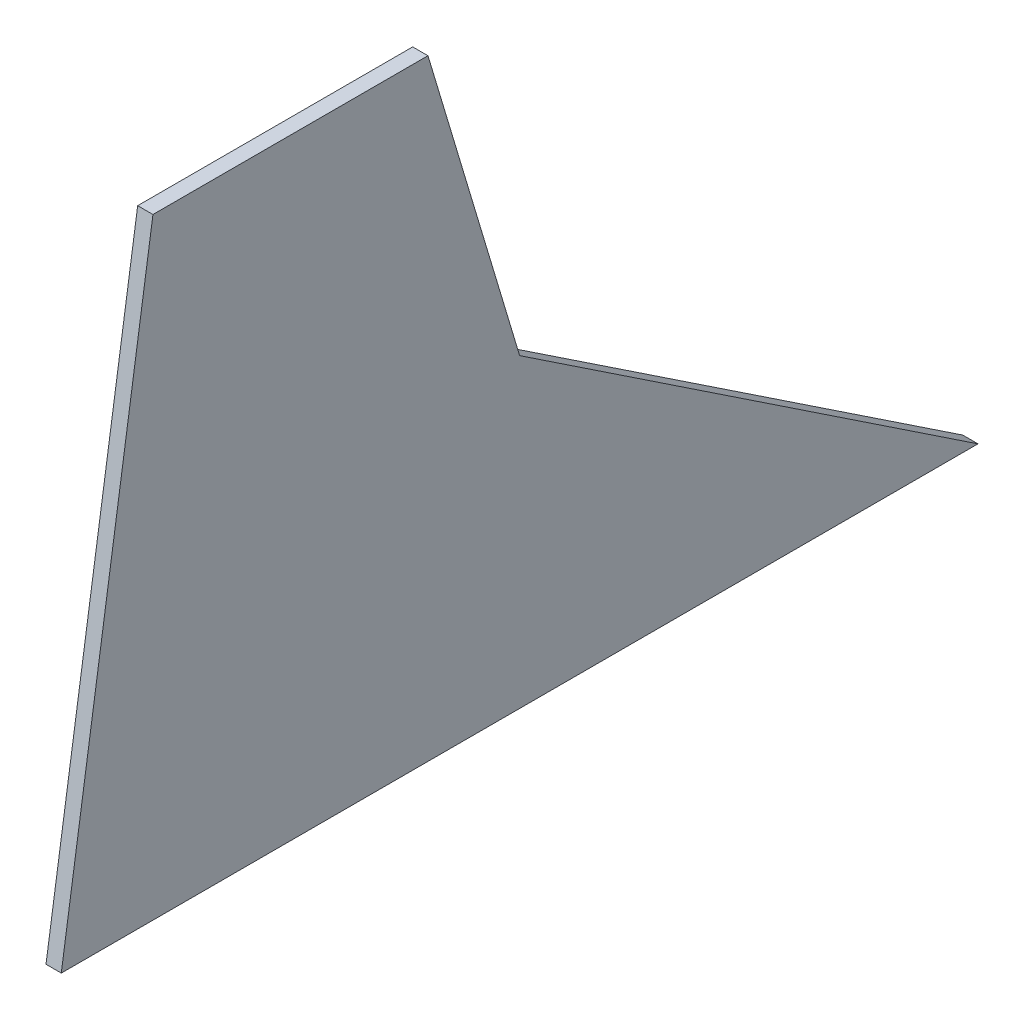
ISO-10303-21;
HEADER;
FILE_DESCRIPTION(('STEP AP214'),'2;1');
FILE_NAME('part.step','',(''),(''),'','','');
FILE_SCHEMA(('AUTOMOTIVE_DESIGN { 1 0 10303 214 1 1 1 1 }'));
ENDSEC;
DATA;
#1=APPLICATION_CONTEXT('core data for automotive mechanical design processes');
#2=APPLICATION_PROTOCOL_DEFINITION('international standard','automotive_design',2000,#1);
#3=PRODUCT_CONTEXT('',#1,'mechanical');
#4=PRODUCT('Part','Part','',(#3));
#5=PRODUCT_RELATED_PRODUCT_CATEGORY('part','',(#4));
#6=PRODUCT_DEFINITION_FORMATION('','',#4);
#7=PRODUCT_DEFINITION_CONTEXT('part definition',#1,'design');
#8=PRODUCT_DEFINITION('design','',#6,#7);
#9=PRODUCT_DEFINITION_SHAPE('','',#8);
#10=(LENGTH_UNIT() NAMED_UNIT(*) SI_UNIT(.MILLI.,.METRE.));
#11=(NAMED_UNIT(*) PLANE_ANGLE_UNIT() SI_UNIT($,.RADIAN.));
#12=(NAMED_UNIT(*) SI_UNIT($,.STERADIAN.) SOLID_ANGLE_UNIT());
#13=UNCERTAINTY_MEASURE_WITH_UNIT(LENGTH_MEASURE(1.E-05),#10,'distance_accuracy_value','');
#14=(GEOMETRIC_REPRESENTATION_CONTEXT(3) GLOBAL_UNCERTAINTY_ASSIGNED_CONTEXT((#13)) GLOBAL_UNIT_ASSIGNED_CONTEXT((#10,
#11,#12)) REPRESENTATION_CONTEXT('',''));
#15=CARTESIAN_POINT('',(0.,0.,0.));
#16=DIRECTION('',(0.,0.,1.));
#17=DIRECTION('',(1.,0.,0.));
#18=AXIS2_PLACEMENT_3D('',#15,#16,#17);
#19=CARTESIAN_POINT('',(5.,0.,-120.));
#20=DIRECTION('',(0.,-0.287347885566345,0.957826285221151));
#21=DIRECTION('',(0.,-0.957826285221152,-0.287347885566346));
#22=AXIS2_PLACEMENT_3D('',#19,#20,#21);
#23=PLANE('',#22);
#24=DIRECTION('',(1.,0.,0.));
#25=VECTOR('',#24,1.);
#26=CARTESIAN_POINT('',(5.,100.,-90.));
#27=LINE('',#26,#25);
#28=CARTESIAN_POINT('',(0.,100.,-90.));
#29=VERTEX_POINT('',#28);
#30=CARTESIAN_POINT('',(5.,100.,-90.));
#31=VERTEX_POINT('',#30);
#32=EDGE_CURVE('E12',#29,#31,#27,.T.);
#33=ORIENTED_EDGE('',*,*,#32,.F.);
#34=DIRECTION('',(0.,0.957826285221151,0.287347885566345));
#35=VECTOR('',#34,1.);
#36=CARTESIAN_POINT('',(0.,0.,-120.));
#37=LINE('',#36,#35);
#38=CARTESIAN_POINT('',(0.,200.,-60.));
#39=VERTEX_POINT('',#38);
#40=EDGE_CURVE('E104',#29,#39,#37,.T.);
#41=ORIENTED_EDGE('',*,*,#40,.T.);
#42=DIRECTION('',(-1.,0.,0.));
#43=VECTOR('',#42,1.);
#44=CARTESIAN_POINT('',(5.,200.,-60.));
#45=LINE('',#44,#43);
#46=CARTESIAN_POINT('',(5.,200.,-60.));
#47=VERTEX_POINT('',#46);
#48=EDGE_CURVE('E58',#47,#39,#45,.T.);
#49=ORIENTED_EDGE('',*,*,#48,.F.);
#50=DIRECTION('',(0.,0.957826285221151,0.287347885566345));
#51=VECTOR('',#50,1.);
#52=CARTESIAN_POINT('',(5.,0.,-120.));
#53=LINE('',#52,#51);
#54=EDGE_CURVE('E123',#31,#47,#53,.T.);
#55=ORIENTED_EDGE('',*,*,#54,.F.);
#56=EDGE_LOOP('',(#33,#41,#49,#55));
#57=FACE_BOUND('',#56,.T.);
#58=ADVANCED_FACE('F50',(#57),#23,.F.);
#59=CARTESIAN_POINT('',(5.,0.,60.));
#60=DIRECTION('',(0.,1.,0.));
#61=DIRECTION('',(0.,0.,1.));
#62=AXIS2_PLACEMENT_3D('',#59,#60,#61);
#63=PLANE('',#62);
#64=DIRECTION('',(0.,0.,-1.));
#65=VECTOR('',#64,1.);
#66=CARTESIAN_POINT('',(0.,0.,60.));
#67=LINE('',#66,#65);
#68=CARTESIAN_POINT('',(0.,0.,60.));
#69=VERTEX_POINT('',#68);
#70=CARTESIAN_POINT('',(0.,0.,-240.));
#71=VERTEX_POINT('',#70);
#72=EDGE_CURVE('E95',#69,#71,#67,.T.);
#73=ORIENTED_EDGE('',*,*,#72,.T.);
#74=DIRECTION('',(-1.,0.,0.));
#75=VECTOR('',#74,1.);
#76=CARTESIAN_POINT('',(5.,0.,-240.));
#77=LINE('',#76,#75);
#78=CARTESIAN_POINT('',(5.,0.,-240.));
#79=VERTEX_POINT('',#78);
#80=EDGE_CURVE('E98',#79,#71,#77,.T.);
#81=ORIENTED_EDGE('',*,*,#80,.F.);
#82=DIRECTION('',(0.,0.,-1.));
#83=VECTOR('',#82,1.);
#84=CARTESIAN_POINT('',(5.,0.,60.));
#85=LINE('',#84,#83);
#86=CARTESIAN_POINT('',(5.,0.,60.));
#87=VERTEX_POINT('',#86);
#88=EDGE_CURVE('E121',#87,#79,#85,.T.);
#89=ORIENTED_EDGE('',*,*,#88,.F.);
#90=DIRECTION('',(-1.,0.,0.));
#91=VECTOR('',#90,1.);
#92=CARTESIAN_POINT('',(5.,0.,60.));
#93=LINE('',#92,#91);
#94=EDGE_CURVE('E100',#87,#69,#93,.T.);
#95=ORIENTED_EDGE('',*,*,#94,.T.);
#96=EDGE_LOOP('',(#73,#81,#89,#95));
#97=FACE_BOUND('',#96,.T.);
#98=ADVANCED_FACE('F52',(#97),#63,.F.);
#99=CARTESIAN_POINT('',(5.,200.,-60.));
#100=DIRECTION('',(0.,-1.,0.));
#101=DIRECTION('',(0.,0.,-1.));
#102=AXIS2_PLACEMENT_3D('',#99,#100,#101);
#103=PLANE('',#102);
#104=DIRECTION('',(0.,0.,1.));
#105=VECTOR('',#104,1.);
#106=CARTESIAN_POINT('',(0.,200.,-60.));
#107=LINE('',#106,#105);
#108=CARTESIAN_POINT('',(0.,200.,30.));
#109=VERTEX_POINT('',#108);
#110=EDGE_CURVE('E117',#39,#109,#107,.T.);
#111=ORIENTED_EDGE('',*,*,#110,.T.);
#112=DIRECTION('',(-1.,0.,0.));
#113=VECTOR('',#112,1.);
#114=CARTESIAN_POINT('',(5.,200.,30.));
#115=LINE('',#114,#113);
#116=CARTESIAN_POINT('',(5.,200.,30.));
#117=VERTEX_POINT('',#116);
#118=EDGE_CURVE('E130',#117,#109,#115,.T.);
#119=ORIENTED_EDGE('',*,*,#118,.F.);
#120=DIRECTION('',(0.,0.,1.));
#121=VECTOR('',#120,1.);
#122=CARTESIAN_POINT('',(5.,200.,-60.));
#123=LINE('',#122,#121);
#124=EDGE_CURVE('E125',#47,#117,#123,.T.);
#125=ORIENTED_EDGE('',*,*,#124,.F.);
#126=ORIENTED_EDGE('',*,*,#48,.T.);
#127=EDGE_LOOP('',(#111,#119,#125,#126));
#128=FACE_BOUND('',#127,.T.);
#129=ADVANCED_FACE('F136',(#128),#103,.F.);
#130=CARTESIAN_POINT('',(5.,200.,30.));
#131=DIRECTION('',(0.,-0.148340452930244,-0.988936352868298));
#132=DIRECTION('',(0.,0.988936352868298,-0.148340452930244));
#133=AXIS2_PLACEMENT_3D('',#130,#131,#132);
#134=PLANE('',#133);
#135=DIRECTION('',(0.,-0.988936352868298,0.148340452930244));
#136=VECTOR('',#135,1.);
#137=CARTESIAN_POINT('',(0.,200.,30.));
#138=LINE('',#137,#136);
#139=EDGE_CURVE('E119',#109,#69,#138,.T.);
#140=ORIENTED_EDGE('',*,*,#139,.T.);
#141=ORIENTED_EDGE('',*,*,#94,.F.);
#142=DIRECTION('',(0.,-0.988936352868298,0.148340452930244));
#143=VECTOR('',#142,1.);
#144=CARTESIAN_POINT('',(5.,200.,30.));
#145=LINE('',#144,#143);
#146=EDGE_CURVE('E127',#117,#87,#145,.T.);
#147=ORIENTED_EDGE('',*,*,#146,.F.);
#148=ORIENTED_EDGE('',*,*,#118,.T.);
#149=EDGE_LOOP('',(#140,#141,#147,#148));
#150=FACE_BOUND('',#149,.T.);
#151=ADVANCED_FACE('F139',(#150),#134,.F.);
#152=CARTESIAN_POINT('',(5.,0.,60.));
#153=DIRECTION('',(-1.,0.,0.));
#154=DIRECTION('',(0.,0.,1.));
#155=AXIS2_PLACEMENT_3D('',#152,#153,#154);
#156=PLANE('',#155);
#157=ORIENTED_EDGE('',*,*,#88,.T.);
#158=DIRECTION('',(0.,0.554700196225229,0.832050294337844));
#159=VECTOR('',#158,1.);
#160=CARTESIAN_POINT('',(5.,0.,-240.));
#161=LINE('',#160,#159);
#162=EDGE_CURVE('E109',#79,#31,#161,.T.);
#163=ORIENTED_EDGE('',*,*,#162,.T.);
#164=ORIENTED_EDGE('',*,*,#54,.T.);
#165=ORIENTED_EDGE('',*,*,#124,.T.);
#166=ORIENTED_EDGE('',*,*,#146,.T.);
#167=EDGE_LOOP('',(#157,#163,#164,#165,#166));
#168=FACE_BOUND('',#167,.T.);
#169=ADVANCED_FACE('F142',(#168),#156,.F.);
#170=CARTESIAN_POINT('',(0.,0.,60.));
#171=DIRECTION('',(-1.,0.,0.));
#172=DIRECTION('',(0.,0.,1.));
#173=AXIS2_PLACEMENT_3D('',#170,#171,#172);
#174=PLANE('',#173);
#175=ORIENTED_EDGE('',*,*,#72,.F.);
#176=ORIENTED_EDGE('',*,*,#139,.F.);
#177=ORIENTED_EDGE('',*,*,#110,.F.);
#178=ORIENTED_EDGE('',*,*,#40,.F.);
#179=DIRECTION('',(0.,0.554700196225229,0.832050294337844));
#180=VECTOR('',#179,1.);
#181=CARTESIAN_POINT('',(0.,0.,-240.));
#182=LINE('',#181,#180);
#183=EDGE_CURVE('E107',#71,#29,#182,.T.);
#184=ORIENTED_EDGE('',*,*,#183,.F.);
#185=EDGE_LOOP('',(#175,#176,#177,#178,#184));
#186=FACE_BOUND('',#185,.T.);
#187=ADVANCED_FACE('F111',(#186),#174,.T.);
#188=CARTESIAN_POINT('',(5.,0.,-240.));
#189=DIRECTION('',(0.,-0.832050294337844,0.554700196225229));
#190=DIRECTION('',(0.,-0.554700196225229,-0.832050294337844));
#191=AXIS2_PLACEMENT_3D('',#188,#189,#190);
#192=PLANE('',#191);
#193=ORIENTED_EDGE('',*,*,#183,.T.);
#194=ORIENTED_EDGE('',*,*,#32,.T.);
#195=ORIENTED_EDGE('',*,*,#162,.F.);
#196=ORIENTED_EDGE('',*,*,#80,.T.);
#197=EDGE_LOOP('',(#193,#194,#195,#196));
#198=FACE_BOUND('',#197,.T.);
#199=ADVANCED_FACE('F106',(#198),#192,.F.);
#200=CLOSED_SHELL('',(#58,#98,#129,#151,#169,#187,#199));
#201=MANIFOLD_SOLID_BREP('B2',#200);
#202=ADVANCED_BREP_SHAPE_REPRESENTATION('',(#18,#201),#14);
#203=SHAPE_DEFINITION_REPRESENTATION(#9,#202);
ENDSEC;
END-ISO-10303-21;
